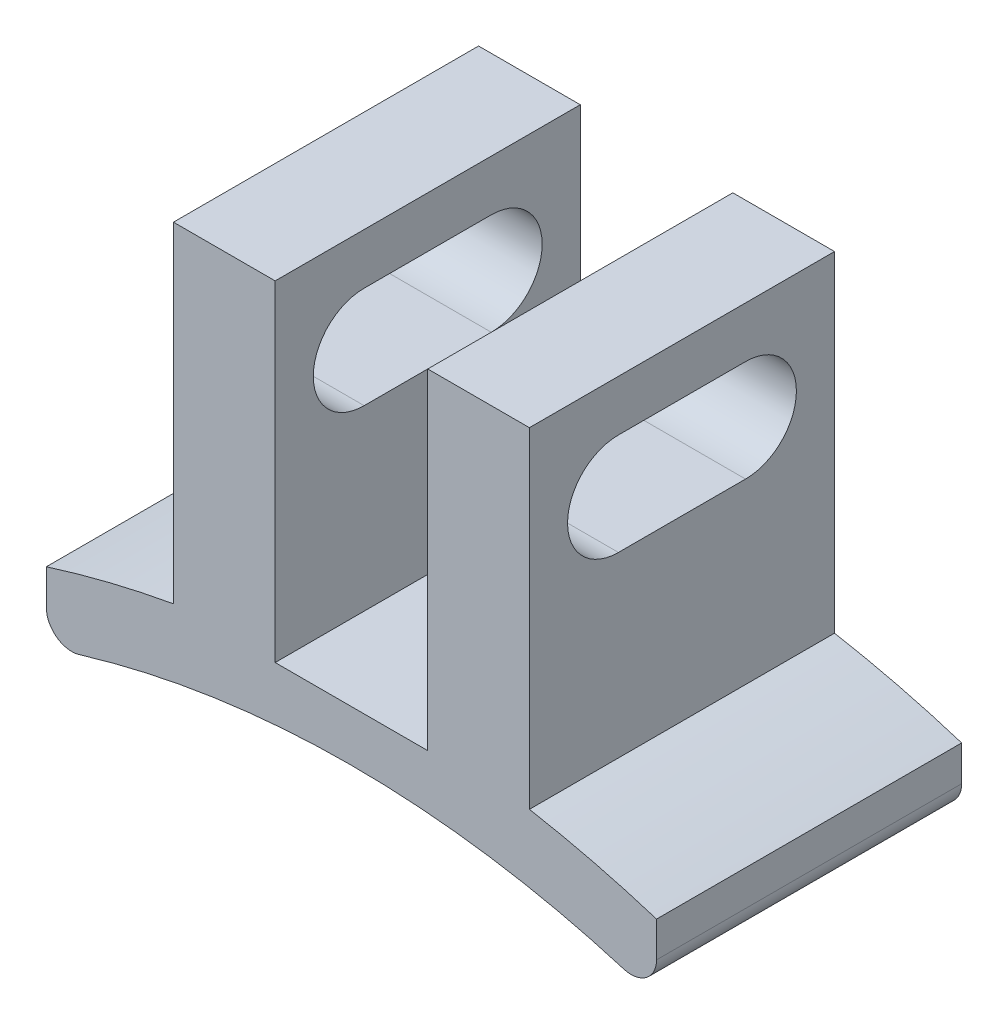
ISO-10303-21;
HEADER;
FILE_DESCRIPTION(('STEP AP214'),'2;1');
FILE_NAME('part.step','',(''),(''),'','','');
FILE_SCHEMA(('AUTOMOTIVE_DESIGN { 1 0 10303 214 1 1 1 1 }'));
ENDSEC;
DATA;
#1=APPLICATION_CONTEXT('core data for automotive mechanical design processes');
#2=APPLICATION_PROTOCOL_DEFINITION('international standard','automotive_design',2000,#1);
#3=PRODUCT_CONTEXT('',#1,'mechanical');
#4=PRODUCT('Part','Part','',(#3));
#5=PRODUCT_RELATED_PRODUCT_CATEGORY('part','',(#4));
#6=PRODUCT_DEFINITION_FORMATION('','',#4);
#7=PRODUCT_DEFINITION_CONTEXT('part definition',#1,'design');
#8=PRODUCT_DEFINITION('design','',#6,#7);
#9=PRODUCT_DEFINITION_SHAPE('','',#8);
#10=(LENGTH_UNIT() NAMED_UNIT(*) SI_UNIT(.MILLI.,.METRE.));
#11=(NAMED_UNIT(*) PLANE_ANGLE_UNIT() SI_UNIT($,.RADIAN.));
#12=(NAMED_UNIT(*) SI_UNIT($,.STERADIAN.) SOLID_ANGLE_UNIT());
#13=UNCERTAINTY_MEASURE_WITH_UNIT(LENGTH_MEASURE(1.E-05),#10,'distance_accuracy_value','');
#14=(GEOMETRIC_REPRESENTATION_CONTEXT(3) GLOBAL_UNCERTAINTY_ASSIGNED_CONTEXT((#13)) GLOBAL_UNIT_ASSIGNED_CONTEXT((#10,
#11,#12)) REPRESENTATION_CONTEXT('',''));
#15=CARTESIAN_POINT('',(0.,0.,0.));
#16=DIRECTION('',(0.,0.,1.));
#17=DIRECTION('',(1.,0.,0.));
#18=AXIS2_PLACEMENT_3D('',#15,#16,#17);
#19=CARTESIAN_POINT('',(3.5,7.5,3.));
#20=DIRECTION('',(-1.,0.,0.));
#21=DIRECTION('',(0.,-1.,0.));
#22=AXIS2_PLACEMENT_3D('',#19,#20,#21);
#23=PLANE('',#22);
#24=DIRECTION('',(0.,0.,1.));
#25=VECTOR('',#24,1.);
#26=CARTESIAN_POINT('',(3.5,4.5,3.));
#27=LINE('',#26,#25);
#28=CARTESIAN_POINT('',(3.5,4.5,-1.25));
#29=VERTEX_POINT('',#28);
#30=CARTESIAN_POINT('',(3.5,4.5,1.25));
#31=VERTEX_POINT('',#30);
#32=EDGE_CURVE('E386',#29,#31,#27,.T.);
#33=ORIENTED_EDGE('',*,*,#32,.T.);
#34=CARTESIAN_POINT('',(3.5,5.5,1.25));
#35=DIRECTION('',(-1.,0.,0.));
#36=DIRECTION('',(0.,-1.,0.));
#37=AXIS2_PLACEMENT_3D('',#34,#35,#36);
#38=CIRCLE('',#37,1.);
#39=CARTESIAN_POINT('',(3.5,6.5,1.25));
#40=VERTEX_POINT('',#39);
#41=EDGE_CURVE('E398',#31,#40,#38,.T.);
#42=ORIENTED_EDGE('',*,*,#41,.T.);
#43=DIRECTION('',(0.,0.,-1.));
#44=VECTOR('',#43,1.);
#45=CARTESIAN_POINT('',(3.5,6.5,3.));
#46=LINE('',#45,#44);
#47=CARTESIAN_POINT('',(3.5,6.5,-1.25));
#48=VERTEX_POINT('',#47);
#49=EDGE_CURVE('E362',#40,#48,#46,.T.);
#50=ORIENTED_EDGE('',*,*,#49,.T.);
#51=CARTESIAN_POINT('',(3.5,5.5,-1.25));
#52=DIRECTION('',(-1.,0.,0.));
#53=DIRECTION('',(0.,-1.,0.));
#54=AXIS2_PLACEMENT_3D('',#51,#52,#53);
#55=CIRCLE('',#54,1.);
#56=EDGE_CURVE('E374',#48,#29,#55,.T.);
#57=ORIENTED_EDGE('',*,*,#56,.T.);
#58=EDGE_LOOP('',(#33,#42,#50,#57));
#59=FACE_BOUND('',#58,.T.);
#60=DIRECTION('',(0.,1.,0.));
#61=VECTOR('',#60,1.);
#62=CARTESIAN_POINT('',(3.5,7.5,-3.));
#63=LINE('',#62,#61);
#64=CARTESIAN_POINT('',(3.5,1.,-3.));
#65=VERTEX_POINT('',#64);
#66=CARTESIAN_POINT('',(3.5,7.5,-3.));
#67=VERTEX_POINT('',#66);
#68=EDGE_CURVE('E402',#65,#67,#63,.T.);
#69=ORIENTED_EDGE('',*,*,#68,.T.);
#70=DIRECTION('',(0.,0.,-1.));
#71=VECTOR('',#70,1.);
#72=CARTESIAN_POINT('',(3.5,7.5,3.));
#73=LINE('',#72,#71);
#74=CARTESIAN_POINT('',(3.5,7.5,3.));
#75=VERTEX_POINT('',#74);
#76=EDGE_CURVE('E245',#75,#67,#73,.T.);
#77=ORIENTED_EDGE('',*,*,#76,.F.);
#78=DIRECTION('',(0.,1.,0.));
#79=VECTOR('',#78,1.);
#80=CARTESIAN_POINT('',(3.5,7.5,3.));
#81=LINE('',#80,#79);
#82=CARTESIAN_POINT('',(3.5,1.,3.));
#83=VERTEX_POINT('',#82);
#84=EDGE_CURVE('E219',#83,#75,#81,.T.);
#85=ORIENTED_EDGE('',*,*,#84,.F.);
#86=DIRECTION('',(0.,0.,-1.));
#87=VECTOR('',#86,1.);
#88=CARTESIAN_POINT('',(3.5,1.,3.));
#89=LINE('',#88,#87);
#90=EDGE_CURVE('E249',#83,#65,#89,.T.);
#91=ORIENTED_EDGE('',*,*,#90,.T.);
#92=EDGE_LOOP('',(#69,#77,#85,#91));
#93=FACE_BOUND('',#92,.T.);
#94=ADVANCED_FACE('F39',(#59,#93),#23,.F.);
#95=CARTESIAN_POINT('',(1.5,7.5,3.));
#96=DIRECTION('',(0.,-1.,0.));
#97=DIRECTION('',(0.,0.,-1.));
#98=AXIS2_PLACEMENT_3D('',#95,#96,#97);
#99=PLANE('',#98);
#100=DIRECTION('',(-1.,0.,0.));
#101=VECTOR('',#100,1.);
#102=CARTESIAN_POINT('',(1.5,7.5,-3.));
#103=LINE('',#102,#101);
#104=CARTESIAN_POINT('',(1.5,7.5,-3.));
#105=VERTEX_POINT('',#104);
#106=EDGE_CURVE('E420',#67,#105,#103,.T.);
#107=ORIENTED_EDGE('',*,*,#106,.T.);
#108=DIRECTION('',(0.,0.,-1.));
#109=VECTOR('',#108,1.);
#110=CARTESIAN_POINT('',(1.5,7.5,3.));
#111=LINE('',#110,#109);
#112=CARTESIAN_POINT('',(1.5,7.5,3.));
#113=VERTEX_POINT('',#112);
#114=EDGE_CURVE('E241',#113,#105,#111,.T.);
#115=ORIENTED_EDGE('',*,*,#114,.F.);
#116=DIRECTION('',(-1.,0.,0.));
#117=VECTOR('',#116,1.);
#118=CARTESIAN_POINT('',(1.5,7.5,3.));
#119=LINE('',#118,#117);
#120=EDGE_CURVE('E269',#75,#113,#119,.T.);
#121=ORIENTED_EDGE('',*,*,#120,.F.);
#122=ORIENTED_EDGE('',*,*,#76,.T.);
#123=EDGE_LOOP('',(#107,#115,#121,#122));
#124=FACE_BOUND('',#123,.T.);
#125=ADVANCED_FACE('F459',(#124),#99,.F.);
#126=CARTESIAN_POINT('',(1.5,7.5,3.));
#127=DIRECTION('',(1.,0.,0.));
#128=DIRECTION('',(0.,1.,0.));
#129=AXIS2_PLACEMENT_3D('',#126,#127,#128);
#130=PLANE('',#129);
#131=DIRECTION('',(0.,0.,1.));
#132=VECTOR('',#131,1.);
#133=CARTESIAN_POINT('',(1.5,6.5,3.));
#134=LINE('',#133,#132);
#135=CARTESIAN_POINT('',(1.5,6.5,-1.25));
#136=VERTEX_POINT('',#135);
#137=CARTESIAN_POINT('',(1.5,6.5,1.25));
#138=VERTEX_POINT('',#137);
#139=EDGE_CURVE('E358',#136,#138,#134,.T.);
#140=ORIENTED_EDGE('',*,*,#139,.T.);
#141=CARTESIAN_POINT('',(1.5,5.5,1.25));
#142=DIRECTION('',(1.,0.,0.));
#143=DIRECTION('',(0.,1.,0.));
#144=AXIS2_PLACEMENT_3D('',#141,#142,#143);
#145=CIRCLE('',#144,1.);
#146=CARTESIAN_POINT('',(1.5,4.5,1.25));
#147=VERTEX_POINT('',#146);
#148=EDGE_CURVE('E394',#138,#147,#145,.T.);
#149=ORIENTED_EDGE('',*,*,#148,.T.);
#150=DIRECTION('',(0.,0.,-1.));
#151=VECTOR('',#150,1.);
#152=CARTESIAN_POINT('',(1.5,4.5,3.));
#153=LINE('',#152,#151);
#154=CARTESIAN_POINT('',(1.5,4.5,-1.25));
#155=VERTEX_POINT('',#154);
#156=EDGE_CURVE('E382',#147,#155,#153,.T.);
#157=ORIENTED_EDGE('',*,*,#156,.T.);
#158=CARTESIAN_POINT('',(1.5,5.5,-1.25));
#159=DIRECTION('',(1.,0.,0.));
#160=DIRECTION('',(0.,1.,0.));
#161=AXIS2_PLACEMENT_3D('',#158,#159,#160);
#162=CIRCLE('',#161,1.);
#163=EDGE_CURVE('E370',#155,#136,#162,.T.);
#164=ORIENTED_EDGE('',*,*,#163,.T.);
#165=EDGE_LOOP('',(#140,#149,#157,#164));
#166=FACE_BOUND('',#165,.T.);
#167=DIRECTION('',(0.,-1.,0.));
#168=VECTOR('',#167,1.);
#169=CARTESIAN_POINT('',(1.5,7.5,-3.));
#170=LINE('',#169,#168);
#171=CARTESIAN_POINT('',(1.5,1.,-3.));
#172=VERTEX_POINT('',#171);
#173=EDGE_CURVE('E423',#105,#172,#170,.T.);
#174=ORIENTED_EDGE('',*,*,#173,.T.);
#175=DIRECTION('',(0.,0.,-1.));
#176=VECTOR('',#175,1.);
#177=CARTESIAN_POINT('',(1.5,1.,3.));
#178=LINE('',#177,#176);
#179=CARTESIAN_POINT('',(1.5,1.,3.));
#180=VERTEX_POINT('',#179);
#181=EDGE_CURVE('E237',#180,#172,#178,.T.);
#182=ORIENTED_EDGE('',*,*,#181,.F.);
#183=DIRECTION('',(0.,-1.,0.));
#184=VECTOR('',#183,1.);
#185=CARTESIAN_POINT('',(1.5,7.5,3.));
#186=LINE('',#185,#184);
#187=EDGE_CURVE('E405',#113,#180,#186,.T.);
#188=ORIENTED_EDGE('',*,*,#187,.F.);
#189=ORIENTED_EDGE('',*,*,#114,.T.);
#190=EDGE_LOOP('',(#174,#182,#188,#189));
#191=FACE_BOUND('',#190,.T.);
#192=ADVANCED_FACE('F455',(#166,#191),#130,.F.);
#193=CARTESIAN_POINT('',(-1.5,1.,3.));
#194=DIRECTION('',(0.,-1.,0.));
#195=DIRECTION('',(1.,0.,0.));
#196=AXIS2_PLACEMENT_3D('',#193,#194,#195);
#197=PLANE('',#196);
#198=DIRECTION('',(-1.,0.,0.));
#199=VECTOR('',#198,1.);
#200=CARTESIAN_POINT('',(-1.5,1.,-3.));
#201=LINE('',#200,#199);
#202=CARTESIAN_POINT('',(-1.5,1.,-3.));
#203=VERTEX_POINT('',#202);
#204=EDGE_CURVE('E426',#172,#203,#201,.T.);
#205=ORIENTED_EDGE('',*,*,#204,.T.);
#206=DIRECTION('',(0.,0.,-1.));
#207=VECTOR('',#206,1.);
#208=CARTESIAN_POINT('',(-1.5,1.,3.));
#209=LINE('',#208,#207);
#210=CARTESIAN_POINT('',(-1.5,1.,3.));
#211=VERTEX_POINT('',#210);
#212=EDGE_CURVE('E233',#211,#203,#209,.T.);
#213=ORIENTED_EDGE('',*,*,#212,.F.);
#214=DIRECTION('',(-1.,0.,0.));
#215=VECTOR('',#214,1.);
#216=CARTESIAN_POINT('',(-1.5,1.,3.));
#217=LINE('',#216,#215);
#218=EDGE_CURVE('E408',#180,#211,#217,.T.);
#219=ORIENTED_EDGE('',*,*,#218,.F.);
#220=ORIENTED_EDGE('',*,*,#181,.T.);
#221=EDGE_LOOP('',(#205,#213,#219,#220));
#222=FACE_BOUND('',#221,.T.);
#223=ADVANCED_FACE('F451',(#222),#197,.F.);
#224=CARTESIAN_POINT('',(-1.5,7.5,3.));
#225=DIRECTION('',(-1.,0.,0.));
#226=DIRECTION('',(0.,-1.,0.));
#227=AXIS2_PLACEMENT_3D('',#224,#225,#226);
#228=PLANE('',#227);
#229=DIRECTION('',(0.,0.,1.));
#230=VECTOR('',#229,1.);
#231=CARTESIAN_POINT('',(-1.5,4.5,3.));
#232=LINE('',#231,#230);
#233=CARTESIAN_POINT('',(-1.5,4.5,-1.25));
#234=VERTEX_POINT('',#233);
#235=CARTESIAN_POINT('',(-1.5,4.5,1.25));
#236=VERTEX_POINT('',#235);
#237=EDGE_CURVE('E378',#234,#236,#232,.T.);
#238=ORIENTED_EDGE('',*,*,#237,.T.);
#239=CARTESIAN_POINT('',(-1.5,5.5,1.25));
#240=DIRECTION('',(-1.,0.,0.));
#241=DIRECTION('',(0.,-1.,0.));
#242=AXIS2_PLACEMENT_3D('',#239,#240,#241);
#243=CIRCLE('',#242,1.);
#244=CARTESIAN_POINT('',(-1.5,6.5,1.25));
#245=VERTEX_POINT('',#244);
#246=EDGE_CURVE('E390',#236,#245,#243,.T.);
#247=ORIENTED_EDGE('',*,*,#246,.T.);
#248=DIRECTION('',(0.,0.,-1.));
#249=VECTOR('',#248,1.);
#250=CARTESIAN_POINT('',(-1.5,6.5,3.));
#251=LINE('',#250,#249);
#252=CARTESIAN_POINT('',(-1.5,6.5,-1.25));
#253=VERTEX_POINT('',#252);
#254=EDGE_CURVE('E354',#245,#253,#251,.T.);
#255=ORIENTED_EDGE('',*,*,#254,.T.);
#256=CARTESIAN_POINT('',(-1.5,5.5,-1.25));
#257=DIRECTION('',(-1.,0.,0.));
#258=DIRECTION('',(0.,-1.,0.));
#259=AXIS2_PLACEMENT_3D('',#256,#257,#258);
#260=CIRCLE('',#259,1.);
#261=EDGE_CURVE('E366',#253,#234,#260,.T.);
#262=ORIENTED_EDGE('',*,*,#261,.T.);
#263=EDGE_LOOP('',(#238,#247,#255,#262));
#264=FACE_BOUND('',#263,.T.);
#265=DIRECTION('',(0.,1.,0.));
#266=VECTOR('',#265,1.);
#267=CARTESIAN_POINT('',(-1.5,7.5,-3.));
#268=LINE('',#267,#266);
#269=CARTESIAN_POINT('',(-1.5,7.5,-3.));
#270=VERTEX_POINT('',#269);
#271=EDGE_CURVE('E429',#203,#270,#268,.T.);
#272=ORIENTED_EDGE('',*,*,#271,.T.);
#273=DIRECTION('',(0.,0.,-1.));
#274=VECTOR('',#273,1.);
#275=CARTESIAN_POINT('',(-1.5,7.5,3.));
#276=LINE('',#275,#274);
#277=CARTESIAN_POINT('',(-1.5,7.5,3.));
#278=VERTEX_POINT('',#277);
#279=EDGE_CURVE('E229',#278,#270,#276,.T.);
#280=ORIENTED_EDGE('',*,*,#279,.F.);
#281=DIRECTION('',(0.,1.,0.));
#282=VECTOR('',#281,1.);
#283=CARTESIAN_POINT('',(-1.5,7.5,3.));
#284=LINE('',#283,#282);
#285=EDGE_CURVE('E411',#211,#278,#284,.T.);
#286=ORIENTED_EDGE('',*,*,#285,.F.);
#287=ORIENTED_EDGE('',*,*,#212,.T.);
#288=EDGE_LOOP('',(#272,#280,#286,#287));
#289=FACE_BOUND('',#288,.T.);
#290=ADVANCED_FACE('F446',(#264,#289),#228,.F.);
#291=CARTESIAN_POINT('',(-1.5,7.5,3.));
#292=DIRECTION('',(0.,-1.,0.));
#293=DIRECTION('',(1.,0.,0.));
#294=AXIS2_PLACEMENT_3D('',#291,#292,#293);
#295=PLANE('',#294);
#296=DIRECTION('',(-1.,0.,0.));
#297=VECTOR('',#296,1.);
#298=CARTESIAN_POINT('',(-1.5,7.5,-3.));
#299=LINE('',#298,#297);
#300=CARTESIAN_POINT('',(-3.5,7.5,-3.));
#301=VERTEX_POINT('',#300);
#302=EDGE_CURVE('E221',#270,#301,#299,.T.);
#303=ORIENTED_EDGE('',*,*,#302,.T.);
#304=DIRECTION('',(0.,0.,-1.));
#305=VECTOR('',#304,1.);
#306=CARTESIAN_POINT('',(-3.5,7.5,3.));
#307=LINE('',#306,#305);
#308=CARTESIAN_POINT('',(-3.5,7.5,3.));
#309=VERTEX_POINT('',#308);
#310=EDGE_CURVE('E225',#309,#301,#307,.T.);
#311=ORIENTED_EDGE('',*,*,#310,.F.);
#312=DIRECTION('',(-1.,0.,0.));
#313=VECTOR('',#312,1.);
#314=CARTESIAN_POINT('',(-1.5,7.5,3.));
#315=LINE('',#314,#313);
#316=EDGE_CURVE('E277',#278,#309,#315,.T.);
#317=ORIENTED_EDGE('',*,*,#316,.F.);
#318=ORIENTED_EDGE('',*,*,#279,.T.);
#319=EDGE_LOOP('',(#303,#311,#317,#318));
#320=FACE_BOUND('',#319,.T.);
#321=ADVANCED_FACE('F435',(#320),#295,.F.);
#322=CARTESIAN_POINT('',(-3.5,7.5,3.));
#323=DIRECTION('',(1.,0.,0.));
#324=DIRECTION('',(0.,1.,0.));
#325=AXIS2_PLACEMENT_3D('',#322,#323,#324);
#326=PLANE('',#325);
#327=DIRECTION('',(0.,0.,1.));
#328=VECTOR('',#327,1.);
#329=CARTESIAN_POINT('',(-3.5,6.5,3.));
#330=LINE('',#329,#328);
#331=CARTESIAN_POINT('',(-3.5,6.5,-1.25));
#332=VERTEX_POINT('',#331);
#333=CARTESIAN_POINT('',(-3.5,6.5,1.25));
#334=VERTEX_POINT('',#333);
#335=EDGE_CURVE('E250',#332,#334,#330,.T.);
#336=ORIENTED_EDGE('',*,*,#335,.T.);
#337=CARTESIAN_POINT('',(-3.5,5.5,1.25));
#338=DIRECTION('',(1.,0.,0.));
#339=DIRECTION('',(0.,1.,0.));
#340=AXIS2_PLACEMENT_3D('',#337,#338,#339);
#341=CIRCLE('',#340,1.);
#342=CARTESIAN_POINT('',(-3.5,4.5,1.25));
#343=VERTEX_POINT('',#342);
#344=EDGE_CURVE('E262',#334,#343,#341,.T.);
#345=ORIENTED_EDGE('',*,*,#344,.T.);
#346=DIRECTION('',(0.,0.,-1.));
#347=VECTOR('',#346,1.);
#348=CARTESIAN_POINT('',(-3.5,4.5,3.));
#349=LINE('',#348,#347);
#350=CARTESIAN_POINT('',(-3.5,4.5,-1.25));
#351=VERTEX_POINT('',#350);
#352=EDGE_CURVE('E258',#343,#351,#349,.T.);
#353=ORIENTED_EDGE('',*,*,#352,.T.);
#354=CARTESIAN_POINT('',(-3.5,5.5,-1.25));
#355=DIRECTION('',(1.,0.,0.));
#356=DIRECTION('',(0.,1.,0.));
#357=AXIS2_PLACEMENT_3D('',#354,#355,#356);
#358=CIRCLE('',#357,1.);
#359=EDGE_CURVE('E254',#351,#332,#358,.T.);
#360=ORIENTED_EDGE('',*,*,#359,.T.);
#361=EDGE_LOOP('',(#336,#345,#353,#360));
#362=FACE_BOUND('',#361,.T.);
#363=DIRECTION('',(0.,-1.,0.));
#364=VECTOR('',#363,1.);
#365=CARTESIAN_POINT('',(-3.5,7.5,-3.));
#366=LINE('',#365,#364);
#367=CARTESIAN_POINT('',(-3.5,1.,-3.));
#368=VERTEX_POINT('',#367);
#369=EDGE_CURVE('E215',#301,#368,#366,.T.);
#370=ORIENTED_EDGE('',*,*,#369,.T.);
#371=DIRECTION('',(0.,0.,-1.));
#372=VECTOR('',#371,1.);
#373=CARTESIAN_POINT('',(-3.5,1.,3.));
#374=LINE('',#373,#372);
#375=CARTESIAN_POINT('',(-3.5,0.999999999999999,3.));
#376=VERTEX_POINT('',#375);
#377=EDGE_CURVE('E195',#376,#368,#374,.T.);
#378=ORIENTED_EDGE('',*,*,#377,.F.);
#379=DIRECTION('',(0.,-1.,0.));
#380=VECTOR('',#379,1.);
#381=CARTESIAN_POINT('',(-3.5,7.5,3.));
#382=LINE('',#381,#380);
#383=EDGE_CURVE('E273',#309,#376,#382,.T.);
#384=ORIENTED_EDGE('',*,*,#383,.F.);
#385=ORIENTED_EDGE('',*,*,#310,.T.);
#386=EDGE_LOOP('',(#370,#378,#384,#385));
#387=FACE_BOUND('',#386,.T.);
#388=ADVANCED_FACE('F441',(#362,#387),#326,.F.);
#389=CARTESIAN_POINT('',(-6.,-1.,3.));
#390=DIRECTION('',(1.,0.,0.));
#391=DIRECTION('',(0.,0.,-1.));
#392=AXIS2_PLACEMENT_3D('',#389,#390,#391);
#393=PLANE('',#392);
#394=DIRECTION('',(0.,-1.,0.));
#395=VECTOR('',#394,1.);
#396=CARTESIAN_POINT('',(-6.,-1.,-3.));
#397=LINE('',#396,#395);
#398=CARTESIAN_POINT('',(-6.,0.381207588499206,-3.));
#399=VERTEX_POINT('',#398);
#400=CARTESIAN_POINT('',(-6.,-0.313466520526783,-3.));
#401=VERTEX_POINT('',#400);
#402=EDGE_CURVE('E204',#399,#401,#397,.T.);
#403=ORIENTED_EDGE('',*,*,#402,.T.);
#404=DIRECTION('',(0.,0.,1.));
#405=VECTOR('',#404,1.);
#406=CARTESIAN_POINT('',(-6.,-0.313466520526783,3.));
#407=LINE('',#406,#405);
#408=CARTESIAN_POINT('',(-6.,-0.313466520526783,3.));
#409=VERTEX_POINT('',#408);
#410=EDGE_CURVE('E11',#401,#409,#407,.T.);
#411=ORIENTED_EDGE('',*,*,#410,.T.);
#412=DIRECTION('',(0.,-1.,0.));
#413=VECTOR('',#412,1.);
#414=CARTESIAN_POINT('',(-6.,-1.,3.));
#415=LINE('',#414,#413);
#416=CARTESIAN_POINT('',(-6.,0.381207588499207,3.));
#417=VERTEX_POINT('',#416);
#418=EDGE_CURVE('E205',#417,#409,#415,.T.);
#419=ORIENTED_EDGE('',*,*,#418,.F.);
#420=DIRECTION('',(0.,0.,1.));
#421=VECTOR('',#420,1.);
#422=CARTESIAN_POINT('',(-6.,0.381207588499206,-3.));
#423=LINE('',#422,#421);
#424=EDGE_CURVE('E192',#399,#417,#423,.T.);
#425=ORIENTED_EDGE('',*,*,#424,.F.);
#426=EDGE_LOOP('',(#403,#411,#419,#425));
#427=FACE_BOUND('',#426,.T.);
#428=ADVANCED_FACE('F203',(#427),#393,.F.);
#429=CARTESIAN_POINT('',(6.,-0.999999999999999,3.));
#430=DIRECTION('',(-1.,0.,0.));
#431=DIRECTION('',(0.,0.,1.));
#432=AXIS2_PLACEMENT_3D('',#429,#430,#431);
#433=PLANE('',#432);
#434=DIRECTION('',(0.,1.,0.));
#435=VECTOR('',#434,1.);
#436=CARTESIAN_POINT('',(6.,-0.999999999999999,3.));
#437=LINE('',#436,#435);
#438=CARTESIAN_POINT('',(6.,-0.313466520526783,3.));
#439=VERTEX_POINT('',#438);
#440=CARTESIAN_POINT('',(6.,0.381207588499209,3.));
#441=VERTEX_POINT('',#440);
#442=EDGE_CURVE('E280',#439,#441,#437,.T.);
#443=ORIENTED_EDGE('',*,*,#442,.F.);
#444=DIRECTION('',(0.,0.,1.));
#445=VECTOR('',#444,1.);
#446=CARTESIAN_POINT('',(6.,-0.313466520526783,3.));
#447=LINE('',#446,#445);
#448=CARTESIAN_POINT('',(6.,-0.313466520526783,-3.));
#449=VERTEX_POINT('',#448);
#450=EDGE_CURVE('E266',#439,#449,#447,.F.);
#451=ORIENTED_EDGE('',*,*,#450,.T.);
#452=DIRECTION('',(0.,1.,0.));
#453=VECTOR('',#452,1.);
#454=CARTESIAN_POINT('',(6.,-0.999999999999999,-3.));
#455=LINE('',#454,#453);
#456=CARTESIAN_POINT('',(6.,0.381207588499209,-3.));
#457=VERTEX_POINT('',#456);
#458=EDGE_CURVE('E214',#449,#457,#455,.T.);
#459=ORIENTED_EDGE('',*,*,#458,.T.);
#460=DIRECTION('',(0.,0.,1.));
#461=VECTOR('',#460,1.);
#462=CARTESIAN_POINT('',(6.,0.381207588499209,-3.));
#463=LINE('',#462,#461);
#464=EDGE_CURVE('E201',#457,#441,#463,.T.);
#465=ORIENTED_EDGE('',*,*,#464,.T.);
#466=EDGE_LOOP('',(#443,#451,#459,#465));
#467=FACE_BOUND('',#466,.T.);
#468=ADVANCED_FACE('F315',(#467),#433,.F.);
#469=CARTESIAN_POINT('',(0.,0.,3.));
#470=DIRECTION('',(0.,0.,1.));
#471=DIRECTION('',(1.,0.,0.));
#472=AXIS2_PLACEMENT_3D('',#469,#470,#471);
#473=PLANE('',#472);
#474=CARTESIAN_POINT('',(0.,-18.5,3.));
#475=DIRECTION('',(0.,0.,1.));
#476=DIRECTION('',(1.,0.,0.));
#477=AXIS2_PLACEMENT_3D('',#474,#475,#476);
#478=CIRCLE('',#477,18.5);
#479=CARTESIAN_POINT('',(5.35526315789474,-0.792059506828712,3.));
#480=VERTEX_POINT('',#479);
#481=CARTESIAN_POINT('',(-5.35526315789474,-0.792059506828712,3.));
#482=VERTEX_POINT('',#481);
#483=EDGE_CURVE('E288',#480,#482,#478,.T.);
#484=ORIENTED_EDGE('',*,*,#483,.F.);
#485=CARTESIAN_POINT('',(5.5,-0.313466520526783,3.));
#486=DIRECTION('',(0.,0.,1.));
#487=DIRECTION('',(1.,0.,0.));
#488=AXIS2_PLACEMENT_3D('',#485,#486,#487);
#489=CIRCLE('',#488,0.5);
#490=EDGE_CURVE('E48',#480,#439,#489,.T.);
#491=ORIENTED_EDGE('',*,*,#490,.T.);
#492=ORIENTED_EDGE('',*,*,#442,.T.);
#493=CARTESIAN_POINT('',(0.,-18.5,3.));
#494=DIRECTION('',(0.,0.,1.));
#495=DIRECTION('',(1.,0.,0.));
#496=AXIS2_PLACEMENT_3D('',#493,#494,#495);
#497=CIRCLE('',#496,19.811612756159);
#498=EDGE_CURVE('E281',#83,#441,#497,.F.);
#499=ORIENTED_EDGE('',*,*,#498,.F.);
#500=ORIENTED_EDGE('',*,*,#84,.T.);
#501=ORIENTED_EDGE('',*,*,#120,.T.);
#502=ORIENTED_EDGE('',*,*,#187,.T.);
#503=ORIENTED_EDGE('',*,*,#218,.T.);
#504=ORIENTED_EDGE('',*,*,#285,.T.);
#505=ORIENTED_EDGE('',*,*,#316,.T.);
#506=ORIENTED_EDGE('',*,*,#383,.T.);
#507=CARTESIAN_POINT('',(0.,-18.5,3.));
#508=DIRECTION('',(0.,0.,1.));
#509=DIRECTION('',(1.,0.,0.));
#510=AXIS2_PLACEMENT_3D('',#507,#508,#509);
#511=CIRCLE('',#510,19.811612756159);
#512=EDGE_CURVE('E285',#417,#376,#511,.F.);
#513=ORIENTED_EDGE('',*,*,#512,.F.);
#514=ORIENTED_EDGE('',*,*,#418,.T.);
#515=CARTESIAN_POINT('',(-5.5,-0.313466520526783,3.));
#516=DIRECTION('',(0.,0.,1.));
#517=DIRECTION('',(1.,0.,0.));
#518=AXIS2_PLACEMENT_3D('',#515,#516,#517);
#519=CIRCLE('',#518,0.5);
#520=EDGE_CURVE('E60',#409,#482,#519,.T.);
#521=ORIENTED_EDGE('',*,*,#520,.T.);
#522=EDGE_LOOP('',(#484,#491,#492,#499,#500,#501,#502,#503,#504,#505,#506,#513,#514,#521));
#523=FACE_BOUND('',#522,.T.);
#524=ADVANCED_FACE('F308',(#523),#473,.T.);
#525=CARTESIAN_POINT('',(0.,0.,-3.));
#526=DIRECTION('',(0.,0.,1.));
#527=DIRECTION('',(1.,0.,0.));
#528=AXIS2_PLACEMENT_3D('',#525,#526,#527);
#529=PLANE('',#528);
#530=ORIENTED_EDGE('',*,*,#458,.F.);
#531=CARTESIAN_POINT('',(5.5,-0.313466520526783,-3.));
#532=DIRECTION('',(0.,0.,1.));
#533=DIRECTION('',(1.,0.,0.));
#534=AXIS2_PLACEMENT_3D('',#531,#532,#533);
#535=CIRCLE('',#534,0.5);
#536=CARTESIAN_POINT('',(5.35526315789474,-0.792059506828712,-3.));
#537=VERTEX_POINT('',#536);
#538=EDGE_CURVE('E294',#449,#537,#535,.F.);
#539=ORIENTED_EDGE('',*,*,#538,.T.);
#540=CARTESIAN_POINT('',(0.,-18.5,-3.));
#541=DIRECTION('',(0.,0.,1.));
#542=DIRECTION('',(1.,0.,0.));
#543=AXIS2_PLACEMENT_3D('',#540,#541,#542);
#544=CIRCLE('',#543,18.5);
#545=CARTESIAN_POINT('',(-5.35526315789474,-0.792059506828712,-3.));
#546=VERTEX_POINT('',#545);
#547=EDGE_CURVE('E207',#537,#546,#544,.T.);
#548=ORIENTED_EDGE('',*,*,#547,.T.);
#549=CARTESIAN_POINT('',(-5.5,-0.313466520526783,-3.));
#550=DIRECTION('',(0.,0.,1.));
#551=DIRECTION('',(1.,0.,0.));
#552=AXIS2_PLACEMENT_3D('',#549,#550,#551);
#553=CIRCLE('',#552,0.5);
#554=EDGE_CURVE('E212',#546,#401,#553,.F.);
#555=ORIENTED_EDGE('',*,*,#554,.T.);
#556=ORIENTED_EDGE('',*,*,#402,.F.);
#557=CARTESIAN_POINT('',(0.,-18.5,-3.));
#558=DIRECTION('',(0.,0.,-1.));
#559=DIRECTION('',(1.,0.,0.));
#560=AXIS2_PLACEMENT_3D('',#557,#558,#559);
#561=CIRCLE('',#560,19.811612756159);
#562=EDGE_CURVE('E189',#399,#368,#561,.T.);
#563=ORIENTED_EDGE('',*,*,#562,.T.);
#564=ORIENTED_EDGE('',*,*,#369,.F.);
#565=ORIENTED_EDGE('',*,*,#302,.F.);
#566=ORIENTED_EDGE('',*,*,#271,.F.);
#567=ORIENTED_EDGE('',*,*,#204,.F.);
#568=ORIENTED_EDGE('',*,*,#173,.F.);
#569=ORIENTED_EDGE('',*,*,#106,.F.);
#570=ORIENTED_EDGE('',*,*,#68,.F.);
#571=CARTESIAN_POINT('',(0.,-18.5,-3.));
#572=DIRECTION('',(0.,0.,-1.));
#573=DIRECTION('',(1.,0.,0.));
#574=AXIS2_PLACEMENT_3D('',#571,#572,#573);
#575=CIRCLE('',#574,19.811612756159);
#576=EDGE_CURVE('E328',#65,#457,#575,.T.);
#577=ORIENTED_EDGE('',*,*,#576,.T.);
#578=EDGE_LOOP('',(#530,#539,#548,#555,#556,#563,#564,#565,#566,#567,#568,#569,#570,#577));
#579=FACE_BOUND('',#578,.T.);
#580=ADVANCED_FACE('F210',(#579),#529,.F.);
#581=CARTESIAN_POINT('',(6.,6.5,1.25));
#582=DIRECTION('',(0.,1.,0.));
#583=DIRECTION('',(0.,0.,1.));
#584=AXIS2_PLACEMENT_3D('',#581,#582,#583);
#585=PLANE('',#584);
#586=DIRECTION('',(-1.,0.,0.));
#587=VECTOR('',#586,1.);
#588=CARTESIAN_POINT('',(6.,6.5,1.25));
#589=LINE('',#588,#587);
#590=EDGE_CURVE('E335',#245,#334,#589,.T.);
#591=ORIENTED_EDGE('',*,*,#590,.T.);
#592=ORIENTED_EDGE('',*,*,#335,.F.);
#593=DIRECTION('',(-1.,0.,0.));
#594=VECTOR('',#593,1.);
#595=CARTESIAN_POINT('',(6.,6.5,-1.25));
#596=LINE('',#595,#594);
#597=EDGE_CURVE('E347',#253,#332,#596,.T.);
#598=ORIENTED_EDGE('',*,*,#597,.F.);
#599=ORIENTED_EDGE('',*,*,#254,.F.);
#600=EDGE_LOOP('',(#591,#592,#598,#599));
#601=FACE_BOUND('',#600,.T.);
#602=ADVANCED_FACE('F477',(#601),#585,.F.);
#603=CARTESIAN_POINT('',(6.,5.5,-1.25));
#604=DIRECTION('',(-1.,0.,0.));
#605=DIRECTION('',(0.,0.,1.));
#606=AXIS2_PLACEMENT_3D('',#603,#604,#605);
#607=CYLINDRICAL_SURFACE('',#606,1.);
#608=ORIENTED_EDGE('',*,*,#597,.T.);
#609=ORIENTED_EDGE('',*,*,#359,.F.);
#610=DIRECTION('',(-1.,0.,0.));
#611=VECTOR('',#610,1.);
#612=CARTESIAN_POINT('',(6.,4.5,-1.25));
#613=LINE('',#612,#611);
#614=EDGE_CURVE('E342',#234,#351,#613,.T.);
#615=ORIENTED_EDGE('',*,*,#614,.F.);
#616=ORIENTED_EDGE('',*,*,#261,.F.);
#617=EDGE_LOOP('',(#608,#609,#615,#616));
#618=FACE_BOUND('',#617,.T.);
#619=ADVANCED_FACE('F546',(#618),#607,.F.);
#620=CARTESIAN_POINT('',(6.,4.5,1.25));
#621=DIRECTION('',(0.,-1.,0.));
#622=DIRECTION('',(0.,0.,-1.));
#623=AXIS2_PLACEMENT_3D('',#620,#621,#622);
#624=PLANE('',#623);
#625=ORIENTED_EDGE('',*,*,#614,.T.);
#626=ORIENTED_EDGE('',*,*,#352,.F.);
#627=DIRECTION('',(-1.,0.,0.));
#628=VECTOR('',#627,1.);
#629=CARTESIAN_POINT('',(6.,4.5,1.25));
#630=LINE('',#629,#628);
#631=EDGE_CURVE('E336',#236,#343,#630,.T.);
#632=ORIENTED_EDGE('',*,*,#631,.F.);
#633=ORIENTED_EDGE('',*,*,#237,.F.);
#634=EDGE_LOOP('',(#625,#626,#632,#633));
#635=FACE_BOUND('',#634,.T.);
#636=ADVANCED_FACE('F553',(#635),#624,.F.);
#637=CARTESIAN_POINT('',(6.,5.5,1.25));
#638=DIRECTION('',(-1.,0.,0.));
#639=DIRECTION('',(0.,0.,1.));
#640=AXIS2_PLACEMENT_3D('',#637,#638,#639);
#641=CYLINDRICAL_SURFACE('',#640,1.);
#642=ORIENTED_EDGE('',*,*,#631,.T.);
#643=ORIENTED_EDGE('',*,*,#344,.F.);
#644=ORIENTED_EDGE('',*,*,#590,.F.);
#645=ORIENTED_EDGE('',*,*,#246,.F.);
#646=EDGE_LOOP('',(#642,#643,#644,#645));
#647=FACE_BOUND('',#646,.T.);
#648=ADVANCED_FACE('F561',(#647),#641,.F.);
#649=EDGE_CURVE('E340',#31,#147,#630,.T.);
#650=ORIENTED_EDGE('',*,*,#649,.T.);
#651=ORIENTED_EDGE('',*,*,#148,.F.);
#652=EDGE_CURVE('E351',#40,#138,#589,.T.);
#653=ORIENTED_EDGE('',*,*,#652,.F.);
#654=ORIENTED_EDGE('',*,*,#41,.F.);
#655=EDGE_LOOP('',(#650,#651,#653,#654));
#656=FACE_BOUND('',#655,.T.);
#657=ADVANCED_FACE('F569',(#656),#641,.F.);
#658=EDGE_CURVE('E341',#29,#155,#613,.T.);
#659=ORIENTED_EDGE('',*,*,#658,.T.);
#660=ORIENTED_EDGE('',*,*,#156,.F.);
#661=ORIENTED_EDGE('',*,*,#649,.F.);
#662=ORIENTED_EDGE('',*,*,#32,.F.);
#663=EDGE_LOOP('',(#659,#660,#661,#662));
#664=FACE_BOUND('',#663,.T.);
#665=ADVANCED_FACE('F563',(#664),#624,.F.);
#666=EDGE_CURVE('E346',#48,#136,#596,.T.);
#667=ORIENTED_EDGE('',*,*,#666,.T.);
#668=ORIENTED_EDGE('',*,*,#163,.F.);
#669=ORIENTED_EDGE('',*,*,#658,.F.);
#670=ORIENTED_EDGE('',*,*,#56,.F.);
#671=EDGE_LOOP('',(#667,#668,#669,#670));
#672=FACE_BOUND('',#671,.T.);
#673=ADVANCED_FACE('F474',(#672),#607,.F.);
#674=ORIENTED_EDGE('',*,*,#652,.T.);
#675=ORIENTED_EDGE('',*,*,#139,.F.);
#676=ORIENTED_EDGE('',*,*,#666,.F.);
#677=ORIENTED_EDGE('',*,*,#49,.F.);
#678=EDGE_LOOP('',(#674,#675,#676,#677));
#679=FACE_BOUND('',#678,.T.);
#680=ADVANCED_FACE('F467',(#679),#585,.F.);
#681=CARTESIAN_POINT('',(0.,-18.5,-3.));
#682=DIRECTION('',(0.,0.,1.));
#683=DIRECTION('',(1.,0.,0.));
#684=AXIS2_PLACEMENT_3D('',#681,#682,#683);
#685=CYLINDRICAL_SURFACE('',#684,19.811612756159);
#686=ORIENTED_EDGE('',*,*,#498,.T.);
#687=ORIENTED_EDGE('',*,*,#464,.F.);
#688=ORIENTED_EDGE('',*,*,#576,.F.);
#689=ORIENTED_EDGE('',*,*,#90,.F.);
#690=EDGE_LOOP('',(#686,#687,#688,#689));
#691=FACE_BOUND('',#690,.T.);
#692=ADVANCED_FACE('F465',(#691),#685,.T.);
#693=CARTESIAN_POINT('',(0.,-18.5,-3.));
#694=DIRECTION('',(0.,0.,1.));
#695=DIRECTION('',(1.,0.,0.));
#696=AXIS2_PLACEMENT_3D('',#693,#694,#695);
#697=CYLINDRICAL_SURFACE('',#696,19.811612756159);
#698=ORIENTED_EDGE('',*,*,#512,.T.);
#699=ORIENTED_EDGE('',*,*,#377,.T.);
#700=ORIENTED_EDGE('',*,*,#562,.F.);
#701=ORIENTED_EDGE('',*,*,#424,.T.);
#702=EDGE_LOOP('',(#698,#699,#700,#701));
#703=FACE_BOUND('',#702,.T.);
#704=ADVANCED_FACE('F191',(#703),#697,.T.);
#705=CARTESIAN_POINT('',(0.,-18.5,-3.));
#706=DIRECTION('',(0.,0.,1.));
#707=DIRECTION('',(1.,0.,0.));
#708=AXIS2_PLACEMENT_3D('',#705,#706,#707);
#709=CYLINDRICAL_SURFACE('',#708,18.5);
#710=ORIENTED_EDGE('',*,*,#547,.F.);
#711=DIRECTION('',(0.,0.,1.));
#712=VECTOR('',#711,1.);
#713=CARTESIAN_POINT('',(5.35526315789474,-0.792059506828709,-3.));
#714=LINE('',#713,#712);
#715=EDGE_CURVE('E301',#537,#480,#714,.T.);
#716=ORIENTED_EDGE('',*,*,#715,.T.);
#717=ORIENTED_EDGE('',*,*,#483,.T.);
#718=DIRECTION('',(0.,0.,1.));
#719=VECTOR('',#718,1.);
#720=CARTESIAN_POINT('',(-5.35526315789474,-0.792059506828709,-3.));
#721=LINE('',#720,#719);
#722=EDGE_CURVE('E297',#482,#546,#721,.F.);
#723=ORIENTED_EDGE('',*,*,#722,.T.);
#724=EDGE_LOOP('',(#710,#716,#717,#723));
#725=FACE_BOUND('',#724,.T.);
#726=ADVANCED_FACE('F323',(#725),#709,.F.);
#727=CARTESIAN_POINT('',(5.5,-0.313466520526783,-3.));
#728=DIRECTION('',(0.,0.,1.));
#729=DIRECTION('',(1.,0.,0.));
#730=AXIS2_PLACEMENT_3D('',#727,#728,#729);
#731=CYLINDRICAL_SURFACE('',#730,0.5);
#732=ORIENTED_EDGE('',*,*,#490,.F.);
#733=ORIENTED_EDGE('',*,*,#715,.F.);
#734=ORIENTED_EDGE('',*,*,#538,.F.);
#735=ORIENTED_EDGE('',*,*,#450,.F.);
#736=EDGE_LOOP('',(#732,#733,#734,#735));
#737=FACE_BOUND('',#736,.T.);
#738=ADVANCED_FACE('F319',(#737),#731,.T.);
#739=CARTESIAN_POINT('',(-5.5,-0.313466520526783,-3.));
#740=DIRECTION('',(0.,0.,1.));
#741=DIRECTION('',(1.,0.,0.));
#742=AXIS2_PLACEMENT_3D('',#739,#740,#741);
#743=CYLINDRICAL_SURFACE('',#742,0.5);
#744=ORIENTED_EDGE('',*,*,#520,.F.);
#745=ORIENTED_EDGE('',*,*,#410,.F.);
#746=ORIENTED_EDGE('',*,*,#554,.F.);
#747=ORIENTED_EDGE('',*,*,#722,.F.);
#748=EDGE_LOOP('',(#744,#745,#746,#747));
#749=FACE_BOUND('',#748,.T.);
#750=ADVANCED_FACE('F41',(#749),#743,.T.);
#751=CLOSED_SHELL('',(#94,#125,#192,#223,#290,#321,#388,#428,#468,#524,#580,#602,#619,#636,#648,
#657,#665,#673,#680,#692,#704,#726,#738,#750));
#752=MANIFOLD_SOLID_BREP('B2',#751);
#753=ADVANCED_BREP_SHAPE_REPRESENTATION('',(#18,#752),#14);
#754=SHAPE_DEFINITION_REPRESENTATION(#9,#753);
ENDSEC;
END-ISO-10303-21;
